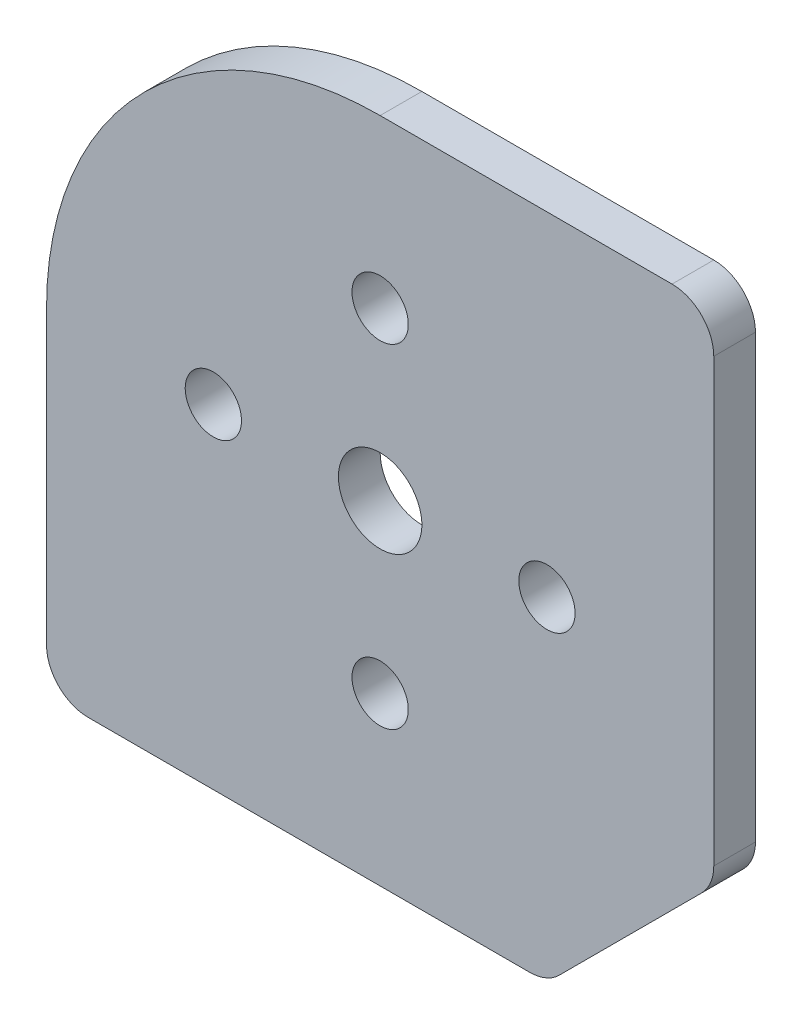
ISO-10303-21;
HEADER;
FILE_DESCRIPTION(('STEP AP214'),'2;1');
FILE_NAME('part.step','',(''),(''),'','','');
FILE_SCHEMA(('AUTOMOTIVE_DESIGN { 1 0 10303 214 1 1 1 1 }'));
ENDSEC;
DATA;
#1=APPLICATION_CONTEXT('core data for automotive mechanical design processes');
#2=APPLICATION_PROTOCOL_DEFINITION('international standard','automotive_design',2000,#1);
#3=PRODUCT_CONTEXT('',#1,'mechanical');
#4=PRODUCT('Part','Part','',(#3));
#5=PRODUCT_RELATED_PRODUCT_CATEGORY('part','',(#4));
#6=PRODUCT_DEFINITION_FORMATION('','',#4);
#7=PRODUCT_DEFINITION_CONTEXT('part definition',#1,'design');
#8=PRODUCT_DEFINITION('design','',#6,#7);
#9=PRODUCT_DEFINITION_SHAPE('','',#8);
#10=(LENGTH_UNIT() NAMED_UNIT(*) SI_UNIT(.MILLI.,.METRE.));
#11=(NAMED_UNIT(*) PLANE_ANGLE_UNIT() SI_UNIT($,.RADIAN.));
#12=(NAMED_UNIT(*) SI_UNIT($,.STERADIAN.) SOLID_ANGLE_UNIT());
#13=UNCERTAINTY_MEASURE_WITH_UNIT(LENGTH_MEASURE(1.E-05),#10,'distance_accuracy_value','');
#14=(GEOMETRIC_REPRESENTATION_CONTEXT(3) GLOBAL_UNCERTAINTY_ASSIGNED_CONTEXT((#13)) GLOBAL_UNIT_ASSIGNED_CONTEXT((#10,
#11,#12)) REPRESENTATION_CONTEXT('',''));
#15=CARTESIAN_POINT('',(0.,0.,0.));
#16=DIRECTION('',(0.,0.,1.));
#17=DIRECTION('',(1.,0.,0.));
#18=AXIS2_PLACEMENT_3D('',#15,#16,#17);
#19=CARTESIAN_POINT('',(-270.,270.,10.));
#20=DIRECTION('',(0.,0.,-1.));
#21=DIRECTION('',(-1.,0.,0.));
#22=AXIS2_PLACEMENT_3D('',#19,#20,#21);
#23=CYLINDRICAL_SURFACE('',#22,80.0000000000001);
#24=CARTESIAN_POINT('',(-270.,270.,0.));
#25=DIRECTION('',(0.,0.,1.));
#26=DIRECTION('',(1.,0.,0.));
#27=AXIS2_PLACEMENT_3D('',#24,#25,#26);
#28=CIRCLE('',#27,80.0000000000001);
#29=CARTESIAN_POINT('',(-270.,350.,0.));
#30=VERTEX_POINT('',#29);
#31=CARTESIAN_POINT('',(-350.,270.,0.));
#32=VERTEX_POINT('',#31);
#33=EDGE_CURVE('E137',#30,#32,#28,.T.);
#34=ORIENTED_EDGE('',*,*,#33,.T.);
#35=DIRECTION('',(0.,0.,-1.));
#36=VECTOR('',#35,1.);
#37=CARTESIAN_POINT('',(-350.,270.,10.));
#38=LINE('',#37,#36);
#39=CARTESIAN_POINT('',(-350.,270.,10.));
#40=VERTEX_POINT('',#39);
#41=EDGE_CURVE('E120',#40,#32,#38,.T.);
#42=ORIENTED_EDGE('',*,*,#41,.F.);
#43=CARTESIAN_POINT('',(-270.,270.,10.));
#44=DIRECTION('',(0.,0.,1.));
#45=DIRECTION('',(1.,0.,0.));
#46=AXIS2_PLACEMENT_3D('',#43,#44,#45);
#47=CIRCLE('',#46,80.0000000000001);
#48=CARTESIAN_POINT('',(-270.,350.,10.));
#49=VERTEX_POINT('',#48);
#50=EDGE_CURVE('E126',#49,#40,#47,.T.);
#51=ORIENTED_EDGE('',*,*,#50,.F.);
#52=DIRECTION('',(0.,0.,-1.));
#53=VECTOR('',#52,1.);
#54=CARTESIAN_POINT('',(-270.,350.,10.));
#55=LINE('',#54,#53);
#56=EDGE_CURVE('E139',#49,#30,#55,.T.);
#57=ORIENTED_EDGE('',*,*,#56,.T.);
#58=EDGE_LOOP('',(#34,#42,#51,#57));
#59=FACE_BOUND('',#58,.T.);
#60=ADVANCED_FACE('F36',(#59),#23,.T.);
#61=CARTESIAN_POINT('',(-350.,190.,10.));
#62=DIRECTION('',(1.,0.,0.));
#63=DIRECTION('',(0.,1.,0.));
#64=AXIS2_PLACEMENT_3D('',#61,#62,#63);
#65=PLANE('',#64);
#66=DIRECTION('',(0.,-1.,0.));
#67=VECTOR('',#66,1.);
#68=CARTESIAN_POINT('',(-350.,190.,0.));
#69=LINE('',#68,#67);
#70=CARTESIAN_POINT('',(-350.,200.,0.));
#71=VERTEX_POINT('',#70);
#72=EDGE_CURVE('E190',#32,#71,#69,.T.);
#73=ORIENTED_EDGE('',*,*,#72,.T.);
#74=DIRECTION('',(0.,0.,-1.));
#75=VECTOR('',#74,1.);
#76=CARTESIAN_POINT('',(-350.,200.,10.));
#77=LINE('',#76,#75);
#78=CARTESIAN_POINT('',(-350.,200.,10.));
#79=VERTEX_POINT('',#78);
#80=EDGE_CURVE('E123',#71,#79,#77,.F.);
#81=ORIENTED_EDGE('',*,*,#80,.T.);
#82=DIRECTION('',(0.,-1.,0.));
#83=VECTOR('',#82,1.);
#84=CARTESIAN_POINT('',(-350.,190.,10.));
#85=LINE('',#84,#83);
#86=EDGE_CURVE('E115',#40,#79,#85,.T.);
#87=ORIENTED_EDGE('',*,*,#86,.F.);
#88=ORIENTED_EDGE('',*,*,#41,.T.);
#89=EDGE_LOOP('',(#73,#81,#87,#88));
#90=FACE_BOUND('',#89,.T.);
#91=ADVANCED_FACE('F118',(#90),#65,.F.);
#92=CARTESIAN_POINT('',(-350.,190.,10.));
#93=DIRECTION('',(0.,1.,0.));
#94=DIRECTION('',(0.,0.,1.));
#95=AXIS2_PLACEMENT_3D('',#92,#93,#94);
#96=PLANE('',#95);
#97=DIRECTION('',(1.,0.,0.));
#98=VECTOR('',#97,1.);
#99=CARTESIAN_POINT('',(-350.,190.,10.));
#100=LINE('',#99,#98);
#101=CARTESIAN_POINT('',(-340.,190.,10.));
#102=VERTEX_POINT('',#101);
#103=CARTESIAN_POINT('',(-234.142135623731,190.,10.));
#104=VERTEX_POINT('',#103);
#105=EDGE_CURVE('E125',#102,#104,#100,.T.);
#106=ORIENTED_EDGE('',*,*,#105,.F.);
#107=DIRECTION('',(0.,0.,-1.));
#108=VECTOR('',#107,1.);
#109=CARTESIAN_POINT('',(-340.,190.,10.));
#110=LINE('',#109,#108);
#111=CARTESIAN_POINT('',(-340.,190.,0.));
#112=VERTEX_POINT('',#111);
#113=EDGE_CURVE('E141',#102,#112,#110,.T.);
#114=ORIENTED_EDGE('',*,*,#113,.T.);
#115=DIRECTION('',(1.,0.,0.));
#116=VECTOR('',#115,1.);
#117=CARTESIAN_POINT('',(-350.,190.,0.));
#118=LINE('',#117,#116);
#119=CARTESIAN_POINT('',(-234.142135623731,190.,0.));
#120=VERTEX_POINT('',#119);
#121=EDGE_CURVE('E185',#112,#120,#118,.T.);
#122=ORIENTED_EDGE('',*,*,#121,.T.);
#123=DIRECTION('',(0.,0.,-1.));
#124=VECTOR('',#123,1.);
#125=CARTESIAN_POINT('',(-234.142135623731,190.,10.));
#126=LINE('',#125,#124);
#127=EDGE_CURVE('E138',#120,#104,#126,.F.);
#128=ORIENTED_EDGE('',*,*,#127,.T.);
#129=EDGE_LOOP('',(#106,#114,#122,#128));
#130=FACE_BOUND('',#129,.T.);
#131=ADVANCED_FACE('F270',(#130),#96,.F.);
#132=CARTESIAN_POINT('',(-230.,190.,10.));
#133=DIRECTION('',(-0.707106781186548,0.707106781186548,0.));
#134=DIRECTION('',(-0.707106781186548,-0.707106781186548,0.));
#135=AXIS2_PLACEMENT_3D('',#132,#133,#134);
#136=PLANE('',#135);
#137=DIRECTION('',(0.707106781186548,0.707106781186548,0.));
#138=VECTOR('',#137,1.);
#139=CARTESIAN_POINT('',(-230.,190.,10.));
#140=LINE('',#139,#138);
#141=CARTESIAN_POINT('',(-227.071067811866,192.928932188134,10.));
#142=VERTEX_POINT('',#141);
#143=CARTESIAN_POINT('',(-192.928932188135,227.071067811865,10.));
#144=VERTEX_POINT('',#143);
#145=EDGE_CURVE('E196',#142,#144,#140,.T.);
#146=ORIENTED_EDGE('',*,*,#145,.F.);
#147=DIRECTION('',(0.,0.,-1.));
#148=VECTOR('',#147,1.);
#149=CARTESIAN_POINT('',(-227.071067811866,192.928932188134,10.));
#150=LINE('',#149,#148);
#151=CARTESIAN_POINT('',(-227.071067811866,192.928932188134,0.));
#152=VERTEX_POINT('',#151);
#153=EDGE_CURVE('E166',#142,#152,#150,.T.);
#154=ORIENTED_EDGE('',*,*,#153,.T.);
#155=DIRECTION('',(0.707106781186548,0.707106781186548,0.));
#156=VECTOR('',#155,1.);
#157=CARTESIAN_POINT('',(-230.,190.,0.));
#158=LINE('',#157,#156);
#159=CARTESIAN_POINT('',(-192.928932188135,227.071067811865,0.));
#160=VERTEX_POINT('',#159);
#161=EDGE_CURVE('E183',#152,#160,#158,.T.);
#162=ORIENTED_EDGE('',*,*,#161,.T.);
#163=DIRECTION('',(0.,0.,-1.));
#164=VECTOR('',#163,1.);
#165=CARTESIAN_POINT('',(-192.928932188135,227.071067811865,10.));
#166=LINE('',#165,#164);
#167=EDGE_CURVE('E164',#160,#144,#166,.F.);
#168=ORIENTED_EDGE('',*,*,#167,.T.);
#169=EDGE_LOOP('',(#146,#154,#162,#168));
#170=FACE_BOUND('',#169,.T.);
#171=ADVANCED_FACE('F291',(#170),#136,.F.);
#172=CARTESIAN_POINT('',(-190.,230.,10.));
#173=DIRECTION('',(-1.,0.,0.));
#174=DIRECTION('',(0.,0.,1.));
#175=AXIS2_PLACEMENT_3D('',#172,#173,#174);
#176=PLANE('',#175);
#177=DIRECTION('',(0.,1.,0.));
#178=VECTOR('',#177,1.);
#179=CARTESIAN_POINT('',(-190.,230.,10.));
#180=LINE('',#179,#178);
#181=CARTESIAN_POINT('',(-190.,234.142135623731,10.));
#182=VERTEX_POINT('',#181);
#183=CARTESIAN_POINT('',(-190.,340.,10.));
#184=VERTEX_POINT('',#183);
#185=EDGE_CURVE('E174',#182,#184,#180,.T.);
#186=ORIENTED_EDGE('',*,*,#185,.F.);
#187=DIRECTION('',(0.,0.,-1.));
#188=VECTOR('',#187,1.);
#189=CARTESIAN_POINT('',(-190.,234.142135623731,10.));
#190=LINE('',#189,#188);
#191=CARTESIAN_POINT('',(-190.,234.142135623731,0.));
#192=VERTEX_POINT('',#191);
#193=EDGE_CURVE('E44',#182,#192,#190,.T.);
#194=ORIENTED_EDGE('',*,*,#193,.T.);
#195=DIRECTION('',(0.,1.,0.));
#196=VECTOR('',#195,1.);
#197=CARTESIAN_POINT('',(-190.,230.,0.));
#198=LINE('',#197,#196);
#199=CARTESIAN_POINT('',(-190.,340.,0.));
#200=VERTEX_POINT('',#199);
#201=EDGE_CURVE('E173',#192,#200,#198,.T.);
#202=ORIENTED_EDGE('',*,*,#201,.T.);
#203=DIRECTION('',(0.,0.,-1.));
#204=VECTOR('',#203,1.);
#205=CARTESIAN_POINT('',(-190.,340.,10.));
#206=LINE('',#205,#204);
#207=EDGE_CURVE('E59',#200,#184,#206,.F.);
#208=ORIENTED_EDGE('',*,*,#207,.T.);
#209=EDGE_LOOP('',(#186,#194,#202,#208));
#210=FACE_BOUND('',#209,.T.);
#211=ADVANCED_FACE('F172',(#210),#176,.F.);
#212=CARTESIAN_POINT('',(-270.,350.,10.));
#213=DIRECTION('',(0.,-1.,0.));
#214=DIRECTION('',(0.,0.,-1.));
#215=AXIS2_PLACEMENT_3D('',#212,#213,#214);
#216=PLANE('',#215);
#217=DIRECTION('',(-1.,0.,0.));
#218=VECTOR('',#217,1.);
#219=CARTESIAN_POINT('',(-270.,350.,10.));
#220=LINE('',#219,#218);
#221=CARTESIAN_POINT('',(-200.,350.,10.));
#222=VERTEX_POINT('',#221);
#223=EDGE_CURVE('E130',#222,#49,#220,.T.);
#224=ORIENTED_EDGE('',*,*,#223,.F.);
#225=DIRECTION('',(0.,0.,-1.));
#226=VECTOR('',#225,1.);
#227=CARTESIAN_POINT('',(-200.,350.,10.));
#228=LINE('',#227,#226);
#229=CARTESIAN_POINT('',(-200.,350.,0.));
#230=VERTEX_POINT('',#229);
#231=EDGE_CURVE('E11',#222,#230,#228,.T.);
#232=ORIENTED_EDGE('',*,*,#231,.T.);
#233=DIRECTION('',(-1.,0.,0.));
#234=VECTOR('',#233,1.);
#235=CARTESIAN_POINT('',(-270.,350.,0.));
#236=LINE('',#235,#234);
#237=EDGE_CURVE('E134',#230,#30,#236,.T.);
#238=ORIENTED_EDGE('',*,*,#237,.T.);
#239=ORIENTED_EDGE('',*,*,#56,.F.);
#240=EDGE_LOOP('',(#224,#232,#238,#239));
#241=FACE_BOUND('',#240,.T.);
#242=ADVANCED_FACE('F297',(#241),#216,.F.);
#243=CARTESIAN_POINT('',(-270.,270.,10.));
#244=DIRECTION('',(0.,0.,1.));
#245=DIRECTION('',(1.,0.,0.));
#246=AXIS2_PLACEMENT_3D('',#243,#244,#245);
#247=PLANE('',#246);
#248=CARTESIAN_POINT('',(-270.,310.,10.));
#249=DIRECTION('',(0.,0.,-1.));
#250=DIRECTION('',(-1.,0.,0.));
#251=AXIS2_PLACEMENT_3D('',#248,#249,#250);
#252=CIRCLE('',#251,6.74999999999998);
#253=CARTESIAN_POINT('',(-276.75,310.,10.));
#254=VERTEX_POINT('',#253);
#255=EDGE_CURVE('E193',#254,#254,#252,.T.);
#256=ORIENTED_EDGE('',*,*,#255,.T.);
#257=EDGE_LOOP('',(#256));
#258=FACE_BOUND('',#257,.T.);
#259=CARTESIAN_POINT('',(-270.,270.,10.));
#260=DIRECTION('',(0.,0.,-1.));
#261=DIRECTION('',(-1.,0.,0.));
#262=AXIS2_PLACEMENT_3D('',#259,#260,#261);
#263=CIRCLE('',#262,9.99999999999998);
#264=CARTESIAN_POINT('',(-280.,270.,10.));
#265=VERTEX_POINT('',#264);
#266=EDGE_CURVE('E218',#265,#265,#263,.T.);
#267=ORIENTED_EDGE('',*,*,#266,.T.);
#268=EDGE_LOOP('',(#267));
#269=FACE_BOUND('',#268,.T.);
#270=CARTESIAN_POINT('',(-270.,230.,10.));
#271=DIRECTION('',(0.,0.,-1.));
#272=DIRECTION('',(-1.,0.,0.));
#273=AXIS2_PLACEMENT_3D('',#270,#271,#272);
#274=CIRCLE('',#273,6.74999999999998);
#275=CARTESIAN_POINT('',(-276.75,230.,10.));
#276=VERTEX_POINT('',#275);
#277=EDGE_CURVE('E205',#276,#276,#274,.T.);
#278=ORIENTED_EDGE('',*,*,#277,.T.);
#279=EDGE_LOOP('',(#278));
#280=FACE_BOUND('',#279,.T.);
#281=CARTESIAN_POINT('',(-230.,270.,10.));
#282=DIRECTION('',(0.,0.,-1.));
#283=DIRECTION('',(-1.,0.,0.));
#284=AXIS2_PLACEMENT_3D('',#281,#282,#283);
#285=CIRCLE('',#284,6.75);
#286=CARTESIAN_POINT('',(-236.75,270.,10.));
#287=VERTEX_POINT('',#286);
#288=EDGE_CURVE('E204',#287,#287,#285,.T.);
#289=ORIENTED_EDGE('',*,*,#288,.T.);
#290=EDGE_LOOP('',(#289));
#291=FACE_BOUND('',#290,.T.);
#292=CARTESIAN_POINT('',(-310.,270.,10.));
#293=DIRECTION('',(0.,0.,-1.));
#294=DIRECTION('',(-1.,0.,0.));
#295=AXIS2_PLACEMENT_3D('',#292,#293,#294);
#296=CIRCLE('',#295,6.74999999999998);
#297=CARTESIAN_POINT('',(-316.75,270.,10.));
#298=VERTEX_POINT('',#297);
#299=EDGE_CURVE('E211',#298,#298,#296,.T.);
#300=ORIENTED_EDGE('',*,*,#299,.T.);
#301=EDGE_LOOP('',(#300));
#302=FACE_BOUND('',#301,.T.);
#303=ORIENTED_EDGE('',*,*,#86,.T.);
#304=CARTESIAN_POINT('',(-340.,200.,10.));
#305=DIRECTION('',(0.,0.,1.));
#306=DIRECTION('',(1.,0.,0.));
#307=AXIS2_PLACEMENT_3D('',#304,#305,#306);
#308=CIRCLE('',#307,10.);
#309=EDGE_CURVE('E162',#79,#102,#308,.T.);
#310=ORIENTED_EDGE('',*,*,#309,.T.);
#311=ORIENTED_EDGE('',*,*,#105,.T.);
#312=CARTESIAN_POINT('',(-234.142135623731,200.,10.));
#313=DIRECTION('',(0.,0.,1.));
#314=DIRECTION('',(1.,0.,0.));
#315=AXIS2_PLACEMENT_3D('',#312,#313,#314);
#316=CIRCLE('',#315,10.);
#317=EDGE_CURVE('E160',#104,#142,#316,.T.);
#318=ORIENTED_EDGE('',*,*,#317,.T.);
#319=ORIENTED_EDGE('',*,*,#145,.T.);
#320=CARTESIAN_POINT('',(-200.,234.142135623731,10.));
#321=DIRECTION('',(0.,0.,1.));
#322=DIRECTION('',(1.,0.,0.));
#323=AXIS2_PLACEMENT_3D('',#320,#321,#322);
#324=CIRCLE('',#323,10.);
#325=EDGE_CURVE('E158',#144,#182,#324,.T.);
#326=ORIENTED_EDGE('',*,*,#325,.T.);
#327=ORIENTED_EDGE('',*,*,#185,.T.);
#328=CARTESIAN_POINT('',(-200.,340.,10.));
#329=DIRECTION('',(0.,0.,1.));
#330=DIRECTION('',(1.,0.,0.));
#331=AXIS2_PLACEMENT_3D('',#328,#329,#330);
#332=CIRCLE('',#331,10.);
#333=EDGE_CURVE('E51',#184,#222,#332,.T.);
#334=ORIENTED_EDGE('',*,*,#333,.T.);
#335=ORIENTED_EDGE('',*,*,#223,.T.);
#336=ORIENTED_EDGE('',*,*,#50,.T.);
#337=EDGE_LOOP('',(#303,#310,#311,#318,#319,#326,#327,#334,#335,#336));
#338=FACE_BOUND('',#337,.T.);
#339=ADVANCED_FACE('F129',(#258,#269,#280,#291,#302,#338),#247,.T.);
#340=CARTESIAN_POINT('',(-270.,270.,0.));
#341=DIRECTION('',(0.,0.,1.));
#342=DIRECTION('',(1.,0.,0.));
#343=AXIS2_PLACEMENT_3D('',#340,#341,#342);
#344=PLANE('',#343);
#345=CARTESIAN_POINT('',(-270.,310.,0.));
#346=DIRECTION('',(0.,0.,-1.));
#347=DIRECTION('',(-1.,0.,0.));
#348=AXIS2_PLACEMENT_3D('',#345,#346,#347);
#349=CIRCLE('',#348,6.74999999999998);
#350=CARTESIAN_POINT('',(-276.75,310.,0.));
#351=VERTEX_POINT('',#350);
#352=EDGE_CURVE('E214',#351,#351,#349,.T.);
#353=ORIENTED_EDGE('',*,*,#352,.F.);
#354=EDGE_LOOP('',(#353));
#355=FACE_BOUND('',#354,.T.);
#356=CARTESIAN_POINT('',(-270.,270.,0.));
#357=DIRECTION('',(0.,0.,-1.));
#358=DIRECTION('',(-1.,0.,0.));
#359=AXIS2_PLACEMENT_3D('',#356,#357,#358);
#360=CIRCLE('',#359,9.99999999999998);
#361=CARTESIAN_POINT('',(-280.,270.,0.));
#362=VERTEX_POINT('',#361);
#363=EDGE_CURVE('E215',#362,#362,#360,.T.);
#364=ORIENTED_EDGE('',*,*,#363,.F.);
#365=EDGE_LOOP('',(#364));
#366=FACE_BOUND('',#365,.T.);
#367=CARTESIAN_POINT('',(-270.,230.,0.));
#368=DIRECTION('',(0.,0.,-1.));
#369=DIRECTION('',(-1.,0.,0.));
#370=AXIS2_PLACEMENT_3D('',#367,#368,#369);
#371=CIRCLE('',#370,6.74999999999998);
#372=CARTESIAN_POINT('',(-276.75,230.,0.));
#373=VERTEX_POINT('',#372);
#374=EDGE_CURVE('E221',#373,#373,#371,.T.);
#375=ORIENTED_EDGE('',*,*,#374,.F.);
#376=EDGE_LOOP('',(#375));
#377=FACE_BOUND('',#376,.T.);
#378=CARTESIAN_POINT('',(-230.,270.,0.));
#379=DIRECTION('',(0.,0.,-1.));
#380=DIRECTION('',(-1.,0.,0.));
#381=AXIS2_PLACEMENT_3D('',#378,#379,#380);
#382=CIRCLE('',#381,6.75);
#383=CARTESIAN_POINT('',(-236.75,270.,0.));
#384=VERTEX_POINT('',#383);
#385=EDGE_CURVE('E201',#384,#384,#382,.T.);
#386=ORIENTED_EDGE('',*,*,#385,.F.);
#387=EDGE_LOOP('',(#386));
#388=FACE_BOUND('',#387,.T.);
#389=CARTESIAN_POINT('',(-310.,270.,0.));
#390=DIRECTION('',(0.,0.,-1.));
#391=DIRECTION('',(-1.,0.,0.));
#392=AXIS2_PLACEMENT_3D('',#389,#390,#391);
#393=CIRCLE('',#392,6.74999999999998);
#394=CARTESIAN_POINT('',(-316.75,270.,0.));
#395=VERTEX_POINT('',#394);
#396=EDGE_CURVE('E208',#395,#395,#393,.T.);
#397=ORIENTED_EDGE('',*,*,#396,.F.);
#398=EDGE_LOOP('',(#397));
#399=FACE_BOUND('',#398,.T.);
#400=ORIENTED_EDGE('',*,*,#121,.F.);
#401=CARTESIAN_POINT('',(-340.,200.,0.));
#402=DIRECTION('',(0.,0.,1.));
#403=DIRECTION('',(1.,0.,0.));
#404=AXIS2_PLACEMENT_3D('',#401,#402,#403);
#405=CIRCLE('',#404,10.);
#406=EDGE_CURVE('E154',#112,#71,#405,.F.);
#407=ORIENTED_EDGE('',*,*,#406,.T.);
#408=ORIENTED_EDGE('',*,*,#72,.F.);
#409=ORIENTED_EDGE('',*,*,#33,.F.);
#410=ORIENTED_EDGE('',*,*,#237,.F.);
#411=CARTESIAN_POINT('',(-200.,340.,0.));
#412=DIRECTION('',(0.,0.,1.));
#413=DIRECTION('',(1.,0.,0.));
#414=AXIS2_PLACEMENT_3D('',#411,#412,#413);
#415=CIRCLE('',#414,10.);
#416=EDGE_CURVE('E148',#230,#200,#415,.F.);
#417=ORIENTED_EDGE('',*,*,#416,.T.);
#418=ORIENTED_EDGE('',*,*,#201,.F.);
#419=CARTESIAN_POINT('',(-200.,234.142135623731,0.));
#420=DIRECTION('',(0.,0.,1.));
#421=DIRECTION('',(1.,0.,0.));
#422=AXIS2_PLACEMENT_3D('',#419,#420,#421);
#423=CIRCLE('',#422,10.);
#424=EDGE_CURVE('E150',#192,#160,#423,.F.);
#425=ORIENTED_EDGE('',*,*,#424,.T.);
#426=ORIENTED_EDGE('',*,*,#161,.F.);
#427=CARTESIAN_POINT('',(-234.142135623731,200.,0.));
#428=DIRECTION('',(0.,0.,1.));
#429=DIRECTION('',(1.,0.,0.));
#430=AXIS2_PLACEMENT_3D('',#427,#428,#429);
#431=CIRCLE('',#430,10.);
#432=EDGE_CURVE('E152',#152,#120,#431,.F.);
#433=ORIENTED_EDGE('',*,*,#432,.T.);
#434=EDGE_LOOP('',(#400,#407,#408,#409,#410,#417,#418,#425,#426,#433));
#435=FACE_BOUND('',#434,.T.);
#436=ADVANCED_FACE('F179',(#355,#366,#377,#388,#399,#435),#344,.F.);
#437=CARTESIAN_POINT('',(-310.,270.,10.));
#438=DIRECTION('',(0.,0.,-1.));
#439=DIRECTION('',(-1.,0.,0.));
#440=AXIS2_PLACEMENT_3D('',#437,#438,#439);
#441=CYLINDRICAL_SURFACE('',#440,6.74999999999998);
#442=ORIENTED_EDGE('',*,*,#299,.F.);
#443=EDGE_LOOP('',(#442));
#444=FACE_BOUND('',#443,.T.);
#445=ORIENTED_EDGE('',*,*,#396,.T.);
#446=EDGE_LOOP('',(#445));
#447=FACE_BOUND('',#446,.T.);
#448=ADVANCED_FACE('F243',(#444,#447),#441,.F.);
#449=CARTESIAN_POINT('',(-230.,270.,10.));
#450=DIRECTION('',(0.,0.,-1.));
#451=DIRECTION('',(-1.,0.,0.));
#452=AXIS2_PLACEMENT_3D('',#449,#450,#451);
#453=CYLINDRICAL_SURFACE('',#452,6.75);
#454=ORIENTED_EDGE('',*,*,#288,.F.);
#455=EDGE_LOOP('',(#454));
#456=FACE_BOUND('',#455,.T.);
#457=ORIENTED_EDGE('',*,*,#385,.T.);
#458=EDGE_LOOP('',(#457));
#459=FACE_BOUND('',#458,.T.);
#460=ADVANCED_FACE('F254',(#456,#459),#453,.F.);
#461=CARTESIAN_POINT('',(-270.,230.,10.));
#462=DIRECTION('',(0.,0.,-1.));
#463=DIRECTION('',(-1.,0.,0.));
#464=AXIS2_PLACEMENT_3D('',#461,#462,#463);
#465=CYLINDRICAL_SURFACE('',#464,6.74999999999998);
#466=ORIENTED_EDGE('',*,*,#277,.F.);
#467=EDGE_LOOP('',(#466));
#468=FACE_BOUND('',#467,.T.);
#469=ORIENTED_EDGE('',*,*,#374,.T.);
#470=EDGE_LOOP('',(#469));
#471=FACE_BOUND('',#470,.T.);
#472=ADVANCED_FACE('F260',(#468,#471),#465,.F.);
#473=CARTESIAN_POINT('',(-270.,270.,10.));
#474=DIRECTION('',(0.,0.,-1.));
#475=DIRECTION('',(-1.,0.,0.));
#476=AXIS2_PLACEMENT_3D('',#473,#474,#475);
#477=CYLINDRICAL_SURFACE('',#476,9.99999999999998);
#478=ORIENTED_EDGE('',*,*,#266,.F.);
#479=EDGE_LOOP('',(#478));
#480=FACE_BOUND('',#479,.T.);
#481=ORIENTED_EDGE('',*,*,#363,.T.);
#482=EDGE_LOOP('',(#481));
#483=FACE_BOUND('',#482,.T.);
#484=ADVANCED_FACE('F237',(#480,#483),#477,.F.);
#485=CARTESIAN_POINT('',(-270.,310.,10.));
#486=DIRECTION('',(0.,0.,-1.));
#487=DIRECTION('',(-1.,0.,0.));
#488=AXIS2_PLACEMENT_3D('',#485,#486,#487);
#489=CYLINDRICAL_SURFACE('',#488,6.74999999999998);
#490=ORIENTED_EDGE('',*,*,#255,.F.);
#491=EDGE_LOOP('',(#490));
#492=FACE_BOUND('',#491,.T.);
#493=ORIENTED_EDGE('',*,*,#352,.T.);
#494=EDGE_LOOP('',(#493));
#495=FACE_BOUND('',#494,.T.);
#496=ADVANCED_FACE('F233',(#492,#495),#489,.F.);
#497=CARTESIAN_POINT('',(-340.,200.,10.));
#498=DIRECTION('',(0.,0.,-1.));
#499=DIRECTION('',(-1.,0.,0.));
#500=AXIS2_PLACEMENT_3D('',#497,#498,#499);
#501=CYLINDRICAL_SURFACE('',#500,10.);
#502=ORIENTED_EDGE('',*,*,#309,.F.);
#503=ORIENTED_EDGE('',*,*,#80,.F.);
#504=ORIENTED_EDGE('',*,*,#406,.F.);
#505=ORIENTED_EDGE('',*,*,#113,.F.);
#506=EDGE_LOOP('',(#502,#503,#504,#505));
#507=FACE_BOUND('',#506,.T.);
#508=ADVANCED_FACE('F236',(#507),#501,.T.);
#509=CARTESIAN_POINT('',(-234.142135623731,200.,10.));
#510=DIRECTION('',(0.,0.,-1.));
#511=DIRECTION('',(-1.,0.,0.));
#512=AXIS2_PLACEMENT_3D('',#509,#510,#511);
#513=CYLINDRICAL_SURFACE('',#512,10.);
#514=ORIENTED_EDGE('',*,*,#317,.F.);
#515=ORIENTED_EDGE('',*,*,#127,.F.);
#516=ORIENTED_EDGE('',*,*,#432,.F.);
#517=ORIENTED_EDGE('',*,*,#153,.F.);
#518=EDGE_LOOP('',(#514,#515,#516,#517));
#519=FACE_BOUND('',#518,.T.);
#520=ADVANCED_FACE('F276',(#519),#513,.T.);
#521=CARTESIAN_POINT('',(-200.,234.142135623731,10.));
#522=DIRECTION('',(0.,0.,-1.));
#523=DIRECTION('',(-1.,0.,0.));
#524=AXIS2_PLACEMENT_3D('',#521,#522,#523);
#525=CYLINDRICAL_SURFACE('',#524,10.);
#526=ORIENTED_EDGE('',*,*,#325,.F.);
#527=ORIENTED_EDGE('',*,*,#167,.F.);
#528=ORIENTED_EDGE('',*,*,#424,.F.);
#529=ORIENTED_EDGE('',*,*,#193,.F.);
#530=EDGE_LOOP('',(#526,#527,#528,#529));
#531=FACE_BOUND('',#530,.T.);
#532=ADVANCED_FACE('F279',(#531),#525,.T.);
#533=CARTESIAN_POINT('',(-200.,340.,10.));
#534=DIRECTION('',(0.,0.,-1.));
#535=DIRECTION('',(-1.,0.,0.));
#536=AXIS2_PLACEMENT_3D('',#533,#534,#535);
#537=CYLINDRICAL_SURFACE('',#536,10.);
#538=ORIENTED_EDGE('',*,*,#333,.F.);
#539=ORIENTED_EDGE('',*,*,#207,.F.);
#540=ORIENTED_EDGE('',*,*,#416,.F.);
#541=ORIENTED_EDGE('',*,*,#231,.F.);
#542=EDGE_LOOP('',(#538,#539,#540,#541));
#543=FACE_BOUND('',#542,.T.);
#544=ADVANCED_FACE('F38',(#543),#537,.T.);
#545=CLOSED_SHELL('',(#60,#91,#131,#171,#211,#242,#339,#436,#448,#460,#472,#484,#496,#508,#520,
#532,#544));
#546=MANIFOLD_SOLID_BREP('B2',#545);
#547=ADVANCED_BREP_SHAPE_REPRESENTATION('',(#18,#546),#14);
#548=SHAPE_DEFINITION_REPRESENTATION(#9,#547);
ENDSEC;
END-ISO-10303-21;
